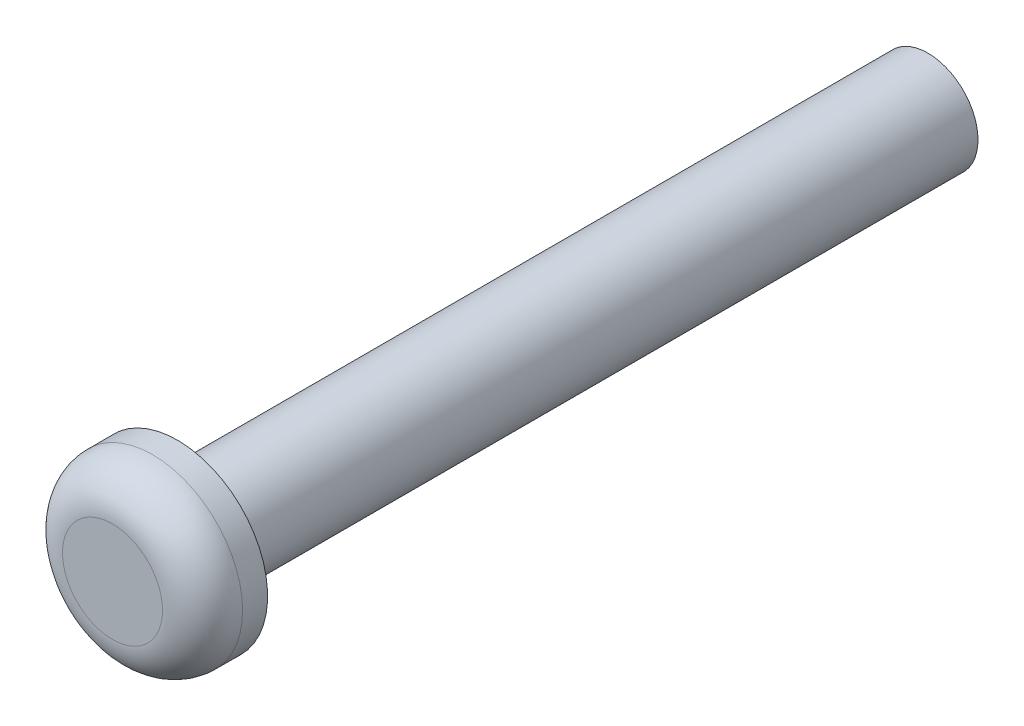
ISO-10303-21;
HEADER;
FILE_DESCRIPTION(('STEP AP214'),'2;1');
FILE_NAME('part.step','',(''),(''),'','','');
FILE_SCHEMA(('AUTOMOTIVE_DESIGN { 1 0 10303 214 1 1 1 1 }'));
ENDSEC;
DATA;
#1=APPLICATION_CONTEXT('core data for automotive mechanical design processes');
#2=APPLICATION_PROTOCOL_DEFINITION('international standard','automotive_design',2000,#1);
#3=PRODUCT_CONTEXT('',#1,'mechanical');
#4=PRODUCT('Part','Part','',(#3));
#5=PRODUCT_RELATED_PRODUCT_CATEGORY('part','',(#4));
#6=PRODUCT_DEFINITION_FORMATION('','',#4);
#7=PRODUCT_DEFINITION_CONTEXT('part definition',#1,'design');
#8=PRODUCT_DEFINITION('design','',#6,#7);
#9=PRODUCT_DEFINITION_SHAPE('','',#8);
#10=(LENGTH_UNIT() NAMED_UNIT(*) SI_UNIT(.MILLI.,.METRE.));
#11=(NAMED_UNIT(*) PLANE_ANGLE_UNIT() SI_UNIT($,.RADIAN.));
#12=(NAMED_UNIT(*) SI_UNIT($,.STERADIAN.) SOLID_ANGLE_UNIT());
#13=UNCERTAINTY_MEASURE_WITH_UNIT(LENGTH_MEASURE(1.E-05),#10,'distance_accuracy_value','');
#14=(GEOMETRIC_REPRESENTATION_CONTEXT(3) GLOBAL_UNCERTAINTY_ASSIGNED_CONTEXT((#13)) GLOBAL_UNIT_ASSIGNED_CONTEXT((#10,
#11,#12)) REPRESENTATION_CONTEXT('',''));
#15=CARTESIAN_POINT('',(0.,0.,0.));
#16=DIRECTION('',(0.,0.,1.));
#17=DIRECTION('',(1.,0.,0.));
#18=AXIS2_PLACEMENT_3D('',#15,#16,#17);
#19=CARTESIAN_POINT('',(0.,0.,6.5));
#20=DIRECTION('',(0.,0.,-1.));
#21=DIRECTION('',(-1.,0.,0.));
#22=AXIS2_PLACEMENT_3D('',#19,#20,#21);
#23=CYLINDRICAL_SURFACE('',#22,9.);
#24=CARTESIAN_POINT('',(0.,0.,2.5));
#25=DIRECTION('',(0.,0.,1.));
#26=DIRECTION('',(1.,0.,0.));
#27=AXIS2_PLACEMENT_3D('',#24,#25,#26);
#28=CIRCLE('',#27,9.);
#29=CARTESIAN_POINT('',(-9.,0.,2.5));
#30=VERTEX_POINT('',#29);
#31=EDGE_CURVE('E37',#30,#30,#28,.F.);
#32=CARTESIAN_POINT('',(0.,0.,0.));
#33=DIRECTION('',(0.,0.,1.));
#34=DIRECTION('',(1.,0.,0.));
#35=AXIS2_PLACEMENT_3D('',#32,#33,#34);
#36=CIRCLE('',#35,9.);
#37=CARTESIAN_POINT('',(-9.,0.,0.));
#38=VERTEX_POINT('',#37);
#39=EDGE_CURVE('E45',#38,#38,#36,.T.);
#40=CARTESIAN_POINT('',(-9.,0.,2.5));
#41=CARTESIAN_POINT('',(-9.,0.,2.47395833333333));
#42=CARTESIAN_POINT('',(-9.,0.,2.44791666666666));
#43=CARTESIAN_POINT('',(-9.,0.,2.39583333333333));
#44=CARTESIAN_POINT('',(-9.,0.,2.36979166666666));
#45=CARTESIAN_POINT('',(-9.,0.,2.31770833333333));
#46=CARTESIAN_POINT('',(-9.,0.,2.29166666666666));
#47=CARTESIAN_POINT('',(-9.,0.,2.23958333333333));
#48=CARTESIAN_POINT('',(-9.,0.,2.21354166666666));
#49=CARTESIAN_POINT('',(-9.,0.,2.16145833333333));
#50=CARTESIAN_POINT('',(-9.,0.,2.13541666666666));
#51=CARTESIAN_POINT('',(-9.,0.,2.08333333333333));
#52=CARTESIAN_POINT('',(-9.,0.,2.05729166666666));
#53=CARTESIAN_POINT('',(-9.,0.,2.00520833333333));
#54=CARTESIAN_POINT('',(-9.,0.,1.97916666666666));
#55=CARTESIAN_POINT('',(-9.,0.,1.92708333333333));
#56=CARTESIAN_POINT('',(-9.,0.,1.90104166666666));
#57=CARTESIAN_POINT('',(-9.,0.,1.84895833333333));
#58=CARTESIAN_POINT('',(-9.,0.,1.82291666666666));
#59=CARTESIAN_POINT('',(-9.,0.,1.77083333333333));
#60=CARTESIAN_POINT('',(-9.,0.,1.74479166666666));
#61=CARTESIAN_POINT('',(-9.,0.,1.69270833333333));
#62=CARTESIAN_POINT('',(-9.,0.,1.66666666666666));
#63=CARTESIAN_POINT('',(-9.,0.,1.61458333333333));
#64=CARTESIAN_POINT('',(-9.,0.,1.58854166666666));
#65=CARTESIAN_POINT('',(-9.,0.,1.53645833333333));
#66=CARTESIAN_POINT('',(-9.,0.,1.51041666666666));
#67=CARTESIAN_POINT('',(-9.,0.,1.45833333333333));
#68=CARTESIAN_POINT('',(-9.,0.,1.43229166666666));
#69=CARTESIAN_POINT('',(-9.,0.,1.38020833333333));
#70=CARTESIAN_POINT('',(-9.,0.,1.35416666666666));
#71=CARTESIAN_POINT('',(-9.,0.,1.30208333333333));
#72=CARTESIAN_POINT('',(-9.,0.,1.27604166666667));
#73=CARTESIAN_POINT('',(-9.,0.,1.22395833333333));
#74=CARTESIAN_POINT('',(-9.,0.,1.19791666666666));
#75=CARTESIAN_POINT('',(-9.,0.,1.14583333333333));
#76=CARTESIAN_POINT('',(-9.,0.,1.11979166666667));
#77=CARTESIAN_POINT('',(-9.,0.,1.06770833333333));
#78=CARTESIAN_POINT('',(-9.,0.,1.04166666666667));
#79=CARTESIAN_POINT('',(-9.,0.,0.989583333333333));
#80=CARTESIAN_POINT('',(-9.,0.,0.963541666666666));
#81=CARTESIAN_POINT('',(-9.,0.,0.911458333333332));
#82=CARTESIAN_POINT('',(-9.,0.,0.885416666666666));
#83=CARTESIAN_POINT('',(-9.,0.,0.833333333333332));
#84=CARTESIAN_POINT('',(-9.,0.,0.807291666666666));
#85=CARTESIAN_POINT('',(-9.,0.,0.755208333333332));
#86=CARTESIAN_POINT('',(-9.,0.,0.729166666666666));
#87=CARTESIAN_POINT('',(-9.,0.,0.677083333333332));
#88=CARTESIAN_POINT('',(-9.,0.,0.651041666666666));
#89=CARTESIAN_POINT('',(-9.,0.,0.598958333333332));
#90=CARTESIAN_POINT('',(-9.,0.,0.572916666666666));
#91=CARTESIAN_POINT('',(-9.,0.,0.520833333333333));
#92=CARTESIAN_POINT('',(-9.,0.,0.494791666666666));
#93=CARTESIAN_POINT('',(-9.,0.,0.442708333333333));
#94=CARTESIAN_POINT('',(-9.,0.,0.416666666666666));
#95=CARTESIAN_POINT('',(-9.,0.,0.364583333333333));
#96=CARTESIAN_POINT('',(-9.,0.,0.338541666666666));
#97=CARTESIAN_POINT('',(-9.,0.,0.286458333333333));
#98=CARTESIAN_POINT('',(-9.,0.,0.260416666666667));
#99=CARTESIAN_POINT('',(-9.,0.,0.208333333333334));
#100=CARTESIAN_POINT('',(-9.,0.,0.182291666666667));
#101=CARTESIAN_POINT('',(-9.,0.,0.130208333333333));
#102=CARTESIAN_POINT('',(-9.,0.,0.104166666666667));
#103=CARTESIAN_POINT('',(-9.,0.,0.0520833333333334));
#104=CARTESIAN_POINT('',(-9.,0.,0.0260416666666667));
#105=CARTESIAN_POINT('',(-9.,0.,0.));
#106=B_SPLINE_CURVE_WITH_KNOTS('',3,(#40,#41,#42,#43,#44,#45,#46,#47,#48,#49,#50,#51,#52,#53,
#54,#55,#56,#57,#58,#59,#60,#61,#62,#63,#64,#65,#66,#67,#68,#69,#70,#71,#72,#73,#74,#75,#76,#77,
#78,#79,#80,#81,#82,#83,#84,#85,#86,#87,#88,#89,#90,#91,#92,#93,#94,#95,#96,#97,#98,#99,#100,
#101,#102,#103,#104,#105),.UNSPECIFIED.,.F.,.F.,(4,2,2,2,2,2,2,2,2,2,2,2,2,2,2,2,2,2,2,2,2,2,2,
2,2,2,2,2,2,2,2,2,4),(0.,0.0781250000000001,0.15625,0.234374999999999,0.312499999999999,
0.390625,0.46875,0.546875,0.624999999999999,0.703124999999999,0.781249999999999,
0.859374999999999,0.937499999999999,1.015625,1.09375,1.171875,1.25,1.328125,1.40625,1.484375,
1.5625,1.640625,1.71875,1.796875,1.875,1.953125,2.03125,2.109375,2.1875,2.265625,2.34375,
2.421875,2.5),.UNSPECIFIED.);
#107=EDGE_CURVE('BSEAM30',#30,#38,#106,.T.);
#108=ORIENTED_EDGE('',*,*,#31,.T.);
#109=ORIENTED_EDGE('',*,*,#39,.T.);
#110=ORIENTED_EDGE('',*,*,#107,.T.);
#111=ORIENTED_EDGE('',*,*,#107,.F.);
#112=EDGE_LOOP('',(#108,#110,#109,#111));
#113=FACE_BOUND('',#112,.T.);
#114=ADVANCED_FACE('F30',(#113),#23,.T.);
#115=CARTESIAN_POINT('',(0.,0.,6.5));
#116=DIRECTION('',(0.,0.,1.));
#117=DIRECTION('',(1.,0.,0.));
#118=AXIS2_PLACEMENT_3D('',#115,#116,#117);
#119=PLANE('',#118);
#120=CARTESIAN_POINT('',(0.,0.,6.5));
#121=DIRECTION('',(0.,0.,1.));
#122=DIRECTION('',(1.,0.,0.));
#123=AXIS2_PLACEMENT_3D('',#120,#121,#122);
#124=CIRCLE('',#123,5.);
#125=CARTESIAN_POINT('',(5.,0.,6.5));
#126=VERTEX_POINT('',#125);
#127=EDGE_CURVE('E41',#126,#126,#124,.T.);
#128=ORIENTED_EDGE('',*,*,#127,.T.);
#129=EDGE_LOOP('',(#128));
#130=FACE_BOUND('',#129,.T.);
#131=ADVANCED_FACE('F68',(#130),#119,.T.);
#132=CARTESIAN_POINT('',(0.,0.,0.));
#133=DIRECTION('',(0.,0.,1.));
#134=DIRECTION('',(1.,0.,0.));
#135=AXIS2_PLACEMENT_3D('',#132,#133,#134);
#136=PLANE('',#135);
#137=CARTESIAN_POINT('',(0.,0.,0.));
#138=DIRECTION('',(0.,0.,1.));
#139=DIRECTION('',(1.,0.,0.));
#140=AXIS2_PLACEMENT_3D('',#137,#138,#139);
#141=CIRCLE('',#140,5.);
#142=CARTESIAN_POINT('',(5.,0.,0.));
#143=VERTEX_POINT('',#142);
#144=EDGE_CURVE('E10',#143,#143,#141,.F.);
#145=ORIENTED_EDGE('',*,*,#144,.F.);
#146=EDGE_LOOP('',(#145));
#147=FACE_BOUND('',#146,.T.);
#148=ORIENTED_EDGE('',*,*,#39,.F.);
#149=EDGE_LOOP('',(#148));
#150=FACE_BOUND('',#149,.T.);
#151=ADVANCED_FACE('F64',(#147,#150),#136,.F.);
#152=CARTESIAN_POINT('',(0.,0.,2.5));
#153=DIRECTION('',(0.,0.,1.));
#154=DIRECTION('',(1.,0.,0.));
#155=AXIS2_PLACEMENT_3D('',#152,#153,#154);
#156=TOROIDAL_SURFACE('',#155,5.,4.);
#157=ORIENTED_EDGE('',*,*,#31,.F.);
#158=EDGE_LOOP('',(#157));
#159=FACE_BOUND('',#158,.T.);
#160=ORIENTED_EDGE('',*,*,#127,.F.);
#161=EDGE_LOOP('',(#160));
#162=FACE_BOUND('',#161,.T.);
#163=ADVANCED_FACE('F32',(#159,#162),#156,.T.);
#164=CARTESIAN_POINT('',(0.,0.,-75.));
#165=DIRECTION('',(0.,0.,1.));
#166=DIRECTION('',(1.,0.,0.));
#167=AXIS2_PLACEMENT_3D('',#164,#165,#166);
#168=CYLINDRICAL_SURFACE('',#167,5.);
#169=CARTESIAN_POINT('',(0.,0.,-75.));
#170=DIRECTION('',(0.,0.,-1.));
#171=DIRECTION('',(-1.,0.,0.));
#172=AXIS2_PLACEMENT_3D('',#169,#170,#171);
#173=CIRCLE('',#172,5.);
#174=CARTESIAN_POINT('',(-5.,0.,-75.));
#175=VERTEX_POINT('',#174);
#176=EDGE_CURVE('E50',#175,#175,#173,.T.);
#177=ORIENTED_EDGE('',*,*,#176,.F.);
#178=EDGE_LOOP('',(#177));
#179=FACE_BOUND('',#178,.T.);
#180=ORIENTED_EDGE('',*,*,#144,.T.);
#181=EDGE_LOOP('',(#180));
#182=FACE_BOUND('',#181,.T.);
#183=ADVANCED_FACE('F56',(#179,#182),#168,.T.);
#184=CARTESIAN_POINT('',(0.,0.,-75.));
#185=DIRECTION('',(0.,0.,-1.));
#186=DIRECTION('',(-1.,0.,0.));
#187=AXIS2_PLACEMENT_3D('',#184,#185,#186);
#188=PLANE('',#187);
#189=ORIENTED_EDGE('',*,*,#176,.T.);
#190=EDGE_LOOP('',(#189));
#191=FACE_BOUND('',#190,.T.);
#192=ADVANCED_FACE('F54',(#191),#188,.T.);
#193=CLOSED_SHELL('',(#114,#131,#151,#163,#183,#192));
#194=MANIFOLD_SOLID_BREP('B2',#193);
#195=ADVANCED_BREP_SHAPE_REPRESENTATION('',(#18,#194),#14);
#196=SHAPE_DEFINITION_REPRESENTATION(#9,#195);
ENDSEC;
END-ISO-10303-21;
